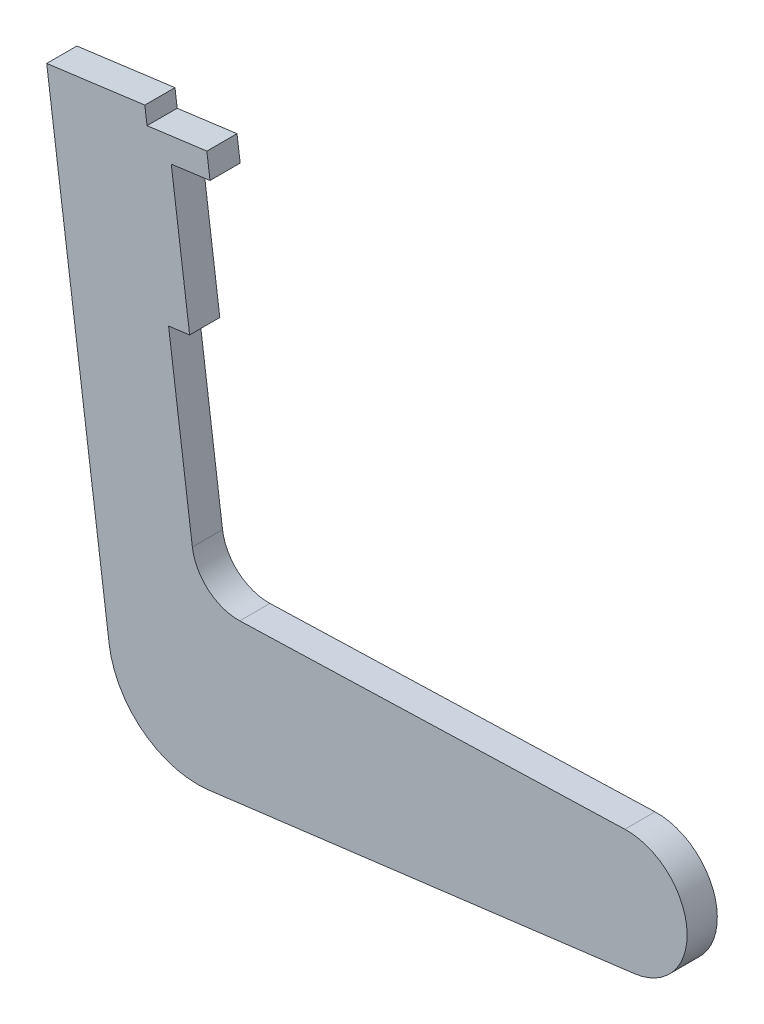
ISO-10303-21;
HEADER;
FILE_DESCRIPTION(('STEP AP214'),'2;1');
FILE_NAME('part.step','',(''),(''),'','','');
FILE_SCHEMA(('AUTOMOTIVE_DESIGN { 1 0 10303 214 1 1 1 1 }'));
ENDSEC;
DATA;
#1=APPLICATION_CONTEXT('core data for automotive mechanical design processes');
#2=APPLICATION_PROTOCOL_DEFINITION('international standard','automotive_design',2000,#1);
#3=PRODUCT_CONTEXT('',#1,'mechanical');
#4=PRODUCT('Part','Part','',(#3));
#5=PRODUCT_RELATED_PRODUCT_CATEGORY('part','',(#4));
#6=PRODUCT_DEFINITION_FORMATION('','',#4);
#7=PRODUCT_DEFINITION_CONTEXT('part definition',#1,'design');
#8=PRODUCT_DEFINITION('design','',#6,#7);
#9=PRODUCT_DEFINITION_SHAPE('','',#8);
#10=(LENGTH_UNIT() NAMED_UNIT(*) SI_UNIT(.MILLI.,.METRE.));
#11=(NAMED_UNIT(*) PLANE_ANGLE_UNIT() SI_UNIT($,.RADIAN.));
#12=(NAMED_UNIT(*) SI_UNIT($,.STERADIAN.) SOLID_ANGLE_UNIT());
#13=UNCERTAINTY_MEASURE_WITH_UNIT(LENGTH_MEASURE(1.E-05),#10,'distance_accuracy_value','');
#14=(GEOMETRIC_REPRESENTATION_CONTEXT(3) GLOBAL_UNCERTAINTY_ASSIGNED_CONTEXT((#13)) GLOBAL_UNIT_ASSIGNED_CONTEXT((#10,
#11,#12)) REPRESENTATION_CONTEXT('',''));
#15=CARTESIAN_POINT('',(0.,0.,0.));
#16=DIRECTION('',(0.,0.,1.));
#17=DIRECTION('',(1.,0.,0.));
#18=AXIS2_PLACEMENT_3D('',#15,#16,#17);
#19=CARTESIAN_POINT('',(-15.3046229831809,46.224450582964,1.5875));
#20=DIRECTION('',(0.991340847616858,0.131313837223228,0.));
#21=DIRECTION('',(-0.131313837223228,0.991340847616858,0.));
#22=AXIS2_PLACEMENT_3D('',#19,#20,#21);
#23=PLANE('',#22);
#24=DIRECTION('',(0.131313837223228,-0.991340847616858,0.));
#25=VECTOR('',#24,1.);
#26=CARTESIAN_POINT('',(-15.3046229831809,46.224450582964,-1.5875));
#27=LINE('',#26,#25);
#28=CARTESIAN_POINT('',(-15.3046229831809,46.224450582964,-1.5875));
#29=VERTEX_POINT('',#28);
#30=CARTESIAN_POINT('',(-8.733941196205,-3.38026275008833,-1.5875));
#31=VERTEX_POINT('',#30);
#32=EDGE_CURVE('E176',#29,#31,#27,.T.);
#33=ORIENTED_EDGE('',*,*,#32,.T.);
#34=DIRECTION('',(0.,0.,-1.));
#35=VECTOR('',#34,1.);
#36=CARTESIAN_POINT('',(-8.733941196205,-3.38026275008833,1.5875));
#37=LINE('',#36,#35);
#38=CARTESIAN_POINT('',(-8.733941196205,-3.38026275008833,1.5875));
#39=VERTEX_POINT('',#38);
#40=EDGE_CURVE('E11',#39,#31,#37,.T.);
#41=ORIENTED_EDGE('',*,*,#40,.F.);
#42=DIRECTION('',(0.131313837223228,-0.991340847616858,0.));
#43=VECTOR('',#42,1.);
#44=CARTESIAN_POINT('',(-15.3046229831809,46.224450582964,1.5875));
#45=LINE('',#44,#43);
#46=CARTESIAN_POINT('',(-15.3046229831809,46.224450582964,1.5875));
#47=VERTEX_POINT('',#46);
#48=EDGE_CURVE('E216',#47,#39,#45,.T.);
#49=ORIENTED_EDGE('',*,*,#48,.F.);
#50=DIRECTION('',(0.,0.,-1.));
#51=VECTOR('',#50,1.);
#52=CARTESIAN_POINT('',(-15.3046229831809,46.224450582964,1.5875));
#53=LINE('',#52,#51);
#54=EDGE_CURVE('E172',#47,#29,#53,.T.);
#55=ORIENTED_EDGE('',*,*,#54,.T.);
#56=EDGE_LOOP('',(#33,#41,#49,#55));
#57=FACE_BOUND('',#56,.T.);
#58=ADVANCED_FACE('F39',(#57),#23,.F.);
#59=CARTESIAN_POINT('',(0.582841403566507,-2.14615394009461,1.5875));
#60=DIRECTION('',(0.,0.,-1.));
#61=DIRECTION('',(-1.,0.,0.));
#62=AXIS2_PLACEMENT_3D('',#59,#60,#61);
#63=CYLINDRICAL_SURFACE('',#62,9.39816272291075);
#64=CARTESIAN_POINT('',(0.582841403566507,-2.14615394009461,-1.5875));
#65=DIRECTION('',(0.,0.,1.));
#66=DIRECTION('',(1.,0.,0.));
#67=AXIS2_PLACEMENT_3D('',#64,#65,#66);
#68=CIRCLE('',#67,9.39816272291075);
#69=CARTESIAN_POINT('',(1.7621034277809,-11.4700374466897,-1.5875));
#70=VERTEX_POINT('',#69);
#71=EDGE_CURVE('E180',#31,#70,#68,.T.);
#72=ORIENTED_EDGE('',*,*,#71,.T.);
#73=DIRECTION('',(0.,0.,-1.));
#74=VECTOR('',#73,1.);
#75=CARTESIAN_POINT('',(1.7621034277809,-11.4700374466897,1.5875));
#76=LINE('',#75,#74);
#77=CARTESIAN_POINT('',(1.7621034277809,-11.4700374466897,1.5875));
#78=VERTEX_POINT('',#77);
#79=EDGE_CURVE('E48',#78,#70,#76,.T.);
#80=ORIENTED_EDGE('',*,*,#79,.F.);
#81=CARTESIAN_POINT('',(0.582841403566507,-2.14615394009461,1.5875));
#82=DIRECTION('',(0.,0.,1.));
#83=DIRECTION('',(1.,0.,0.));
#84=AXIS2_PLACEMENT_3D('',#81,#82,#83);
#85=CIRCLE('',#84,9.39816272291075);
#86=EDGE_CURVE('E117',#39,#78,#85,.T.);
#87=ORIENTED_EDGE('',*,*,#86,.F.);
#88=ORIENTED_EDGE('',*,*,#40,.T.);
#89=EDGE_LOOP('',(#72,#80,#87,#88));
#90=FACE_BOUND('',#89,.T.);
#91=ADVANCED_FACE('F324',(#90),#63,.T.);
#92=CARTESIAN_POINT('',(1.7621034277809,-11.4700374466897,1.5875));
#93=DIRECTION('',(-0.125477932121733,0.992096410915015,0.));
#94=DIRECTION('',(-0.992096410915015,-0.125477932121733,0.));
#95=AXIS2_PLACEMENT_3D('',#92,#93,#94);
#96=PLANE('',#95);
#97=DIRECTION('',(0.992096410915015,0.125477932121733,0.));
#98=VECTOR('',#97,1.);
#99=CARTESIAN_POINT('',(1.7621034277809,-11.4700374466897,-1.5875));
#100=LINE('',#99,#98);
#101=CARTESIAN_POINT('',(46.5301958838679,-5.80787840184098,-1.5875));
#102=VERTEX_POINT('',#101);
#103=EDGE_CURVE('E183',#70,#102,#100,.T.);
#104=ORIENTED_EDGE('',*,*,#103,.T.);
#105=DIRECTION('',(0.,0.,-1.));
#106=VECTOR('',#105,1.);
#107=CARTESIAN_POINT('',(46.5301958838679,-5.80787840184098,1.5875));
#108=LINE('',#107,#106);
#109=CARTESIAN_POINT('',(46.5301958838679,-5.80787840184098,1.5875));
#110=VERTEX_POINT('',#109);
#111=EDGE_CURVE('E251',#110,#102,#108,.T.);
#112=ORIENTED_EDGE('',*,*,#111,.F.);
#113=DIRECTION('',(0.992096410915015,0.125477932121733,0.));
#114=VECTOR('',#113,1.);
#115=CARTESIAN_POINT('',(1.7621034277809,-11.4700374466897,1.5875));
#116=LINE('',#115,#114);
#117=EDGE_CURVE('E261',#78,#110,#116,.T.);
#118=ORIENTED_EDGE('',*,*,#117,.F.);
#119=ORIENTED_EDGE('',*,*,#79,.T.);
#120=EDGE_LOOP('',(#104,#112,#118,#119));
#121=FACE_BOUND('',#120,.T.);
#122=ADVANCED_FACE('F259',(#121),#96,.F.);
#123=CARTESIAN_POINT('',(45.7325212011876,0.498969155999712,1.5875));
#124=DIRECTION('',(0.,0.,-1.));
#125=DIRECTION('',(-1.,0.,0.));
#126=AXIS2_PLACEMENT_3D('',#123,#124,#125);
#127=CYLINDRICAL_SURFACE('',#126,6.35709139601046);
#128=CARTESIAN_POINT('',(45.7325212011876,0.498969155999712,-1.5875));
#129=DIRECTION('',(0.,0.,1.));
#130=DIRECTION('',(1.,0.,0.));
#131=AXIS2_PLACEMENT_3D('',#128,#129,#130);
#132=CIRCLE('',#131,6.35709139601046);
#133=CARTESIAN_POINT('',(45.533364228987,6.85294015984086,-1.5875));
#134=VERTEX_POINT('',#133);
#135=EDGE_CURVE('E186',#102,#134,#132,.T.);
#136=ORIENTED_EDGE('',*,*,#135,.T.);
#137=DIRECTION('',(0.,0.,-1.));
#138=VECTOR('',#137,1.);
#139=CARTESIAN_POINT('',(45.533364228987,6.85294015984086,1.5875));
#140=LINE('',#139,#138);
#141=CARTESIAN_POINT('',(45.533364228987,6.85294015984086,1.5875));
#142=VERTEX_POINT('',#141);
#143=EDGE_CURVE('E247',#142,#134,#140,.T.);
#144=ORIENTED_EDGE('',*,*,#143,.F.);
#145=CARTESIAN_POINT('',(45.7325212011876,0.498969155999712,1.5875));
#146=DIRECTION('',(0.,0.,1.));
#147=DIRECTION('',(1.,0.,0.));
#148=AXIS2_PLACEMENT_3D('',#145,#146,#147);
#149=CIRCLE('',#148,6.35709139601046);
#150=EDGE_CURVE('E280',#110,#142,#149,.T.);
#151=ORIENTED_EDGE('',*,*,#150,.F.);
#152=ORIENTED_EDGE('',*,*,#111,.T.);
#153=EDGE_LOOP('',(#136,#144,#151,#152));
#154=FACE_BOUND('',#153,.T.);
#155=ADVANCED_FACE('F270',(#154),#127,.T.);
#156=CARTESIAN_POINT('',(45.533364228987,6.85294015984086,1.5875));
#157=DIRECTION('',(0.0313283166458152,-0.999509147820139,0.));
#158=DIRECTION('',(0.999509147820139,0.0313283166458152,0.));
#159=AXIS2_PLACEMENT_3D('',#156,#157,#158);
#160=PLANE('',#159);
#161=DIRECTION('',(-0.999509147820139,-0.0313283166458152,0.));
#162=VECTOR('',#161,1.);
#163=CARTESIAN_POINT('',(45.533364228987,6.85294015984086,-1.5875));
#164=LINE('',#163,#162);
#165=CARTESIAN_POINT('',(5.01537701681908,5.58295645233575,-1.5875));
#166=VERTEX_POINT('',#165);
#167=EDGE_CURVE('E189',#134,#166,#164,.T.);
#168=ORIENTED_EDGE('',*,*,#167,.T.);
#169=DIRECTION('',(0.,0.,-1.));
#170=VECTOR('',#169,1.);
#171=CARTESIAN_POINT('',(5.01537701681908,5.58295645233575,1.5875));
#172=LINE('',#171,#170);
#173=CARTESIAN_POINT('',(5.01537701681908,5.58295645233575,1.5875));
#174=VERTEX_POINT('',#173);
#175=EDGE_CURVE('E243',#174,#166,#172,.T.);
#176=ORIENTED_EDGE('',*,*,#175,.F.);
#177=DIRECTION('',(-0.999509147820139,-0.0313283166458152,0.));
#178=VECTOR('',#177,1.);
#179=CARTESIAN_POINT('',(45.533364228987,6.85294015984086,1.5875));
#180=LINE('',#179,#178);
#181=EDGE_CURVE('E276',#142,#174,#180,.T.);
#182=ORIENTED_EDGE('',*,*,#181,.F.);
#183=ORIENTED_EDGE('',*,*,#143,.T.);
#184=EDGE_LOOP('',(#168,#176,#182,#183));
#185=FACE_BOUND('',#184,.T.);
#186=ADVANCED_FACE('F274',(#185),#160,.F.);
#187=CARTESIAN_POINT('',(4.86241844011099,10.4629983130487,1.5875));
#188=DIRECTION('',(0.,0.,-1.));
#189=DIRECTION('',(-1.,0.,0.));
#190=AXIS2_PLACEMENT_3D('',#187,#188,#189);
#191=CYLINDRICAL_SURFACE('',#190,4.88243841625256);
#192=CARTESIAN_POINT('',(4.86241844011099,10.4629983130487,-1.5875));
#193=DIRECTION('',(0.,0.,-1.));
#194=DIRECTION('',(1.,0.,0.));
#195=AXIS2_PLACEMENT_3D('',#192,#193,#194);
#196=CIRCLE('',#195,4.88243841625256);
#197=CARTESIAN_POINT('',(0.0222578021060642,9.82186658960443,-1.5875));
#198=VERTEX_POINT('',#197);
#199=EDGE_CURVE('E192',#166,#198,#196,.T.);
#200=ORIENTED_EDGE('',*,*,#199,.T.);
#201=DIRECTION('',(0.,0.,-1.));
#202=VECTOR('',#201,1.);
#203=CARTESIAN_POINT('',(0.0222578021060642,9.82186658960443,1.5875));
#204=LINE('',#203,#202);
#205=CARTESIAN_POINT('',(0.0222578021060642,9.82186658960443,1.5875));
#206=VERTEX_POINT('',#205);
#207=EDGE_CURVE('E239',#206,#198,#204,.T.);
#208=ORIENTED_EDGE('',*,*,#207,.F.);
#209=CARTESIAN_POINT('',(4.86241844011099,10.4629983130487,1.5875));
#210=DIRECTION('',(0.,0.,-1.));
#211=DIRECTION('',(1.,0.,0.));
#212=AXIS2_PLACEMENT_3D('',#209,#210,#211);
#213=CIRCLE('',#212,4.88243841625256);
#214=EDGE_CURVE('E279',#174,#206,#213,.T.);
#215=ORIENTED_EDGE('',*,*,#214,.F.);
#216=ORIENTED_EDGE('',*,*,#175,.T.);
#217=EDGE_LOOP('',(#200,#208,#215,#216));
#218=FACE_BOUND('',#217,.T.);
#219=ADVANCED_FACE('F337',(#218),#191,.F.);
#220=CARTESIAN_POINT('',(0.0222578021060642,9.82186658960443,1.5875));
#221=DIRECTION('',(-0.991340847616858,-0.131313837223228,0.));
#222=DIRECTION('',(0.131313837223228,-0.991340847616859,0.));
#223=AXIS2_PLACEMENT_3D('',#220,#221,#222);
#224=PLANE('',#223);
#225=DIRECTION('',(-0.131313837223228,0.991340847616858,0.));
#226=VECTOR('',#225,1.);
#227=CARTESIAN_POINT('',(0.0222578021060642,9.82186658960443,-1.5875));
#228=LINE('',#227,#226);
#229=CARTESIAN_POINT('',(-2.47927079699643,28.7069097367056,-1.5875));
#230=VERTEX_POINT('',#229);
#231=EDGE_CURVE('E195',#198,#230,#228,.T.);
#232=ORIENTED_EDGE('',*,*,#231,.T.);
#233=DIRECTION('',(0.,0.,-1.));
#234=VECTOR('',#233,1.);
#235=CARTESIAN_POINT('',(-2.47927079699643,28.7069097367056,1.5875));
#236=LINE('',#235,#234);
#237=CARTESIAN_POINT('',(-2.47927079699643,28.7069097367056,1.5875));
#238=VERTEX_POINT('',#237);
#239=EDGE_CURVE('E235',#238,#230,#236,.T.);
#240=ORIENTED_EDGE('',*,*,#239,.F.);
#241=DIRECTION('',(-0.131313837223228,0.991340847616858,0.));
#242=VECTOR('',#241,1.);
#243=CARTESIAN_POINT('',(0.0222578021060642,9.82186658960443,1.5875));
#244=LINE('',#243,#242);
#245=EDGE_CURVE('E284',#206,#238,#244,.T.);
#246=ORIENTED_EDGE('',*,*,#245,.F.);
#247=ORIENTED_EDGE('',*,*,#207,.T.);
#248=EDGE_LOOP('',(#232,#240,#246,#247));
#249=FACE_BOUND('',#248,.T.);
#250=ADVANCED_FACE('F340',(#249),#224,.F.);
#251=CARTESIAN_POINT('',(-2.47927079699643,28.7069097367056,1.5875));
#252=DIRECTION('',(-0.131313837223227,0.991340847616859,0.));
#253=DIRECTION('',(-0.991340847616859,-0.131313837223227,0.));
#254=AXIS2_PLACEMENT_3D('',#251,#252,#253);
#255=PLANE('',#254);
#256=DIRECTION('',(0.991340847616859,0.131313837223227,0.));
#257=VECTOR('',#256,1.);
#258=CARTESIAN_POINT('',(-2.47927079699643,28.7069097367056,-1.5875));
#259=LINE('',#258,#257);
#260=CARTESIAN_POINT('',(-0.26342573440323,29.0004224256669,-1.5875));
#261=VERTEX_POINT('',#260);
#262=EDGE_CURVE('E198',#230,#261,#259,.T.);
#263=ORIENTED_EDGE('',*,*,#262,.T.);
#264=DIRECTION('',(0.,0.,-1.));
#265=VECTOR('',#264,1.);
#266=CARTESIAN_POINT('',(-0.26342573440323,29.0004224256669,1.5875));
#267=LINE('',#266,#265);
#268=CARTESIAN_POINT('',(-0.26342573440323,29.0004224256669,1.5875));
#269=VERTEX_POINT('',#268);
#270=EDGE_CURVE('E231',#269,#261,#267,.T.);
#271=ORIENTED_EDGE('',*,*,#270,.F.);
#272=DIRECTION('',(0.991340847616859,0.131313837223227,0.));
#273=VECTOR('',#272,1.);
#274=CARTESIAN_POINT('',(-2.47927079699643,28.7069097367056,1.5875));
#275=LINE('',#274,#273);
#276=EDGE_CURVE('E291',#238,#269,#275,.T.);
#277=ORIENTED_EDGE('',*,*,#276,.F.);
#278=ORIENTED_EDGE('',*,*,#239,.T.);
#279=EDGE_LOOP('',(#263,#271,#277,#278));
#280=FACE_BOUND('',#279,.T.);
#281=ADVANCED_FACE('F344',(#280),#255,.F.);
#282=CARTESIAN_POINT('',(-0.26342573440323,29.0004224256669,1.5875));
#283=DIRECTION('',(-0.991340847616858,-0.131313837223229,0.));
#284=DIRECTION('',(0.131313837223229,-0.991340847616858,0.));
#285=AXIS2_PLACEMENT_3D('',#282,#283,#284);
#286=PLANE('',#285);
#287=DIRECTION('',(-0.131313837223229,0.991340847616858,0.));
#288=VECTOR('',#287,1.);
#289=CARTESIAN_POINT('',(-0.26342573440323,29.0004224256669,-1.5875));
#290=LINE('',#289,#288);
#291=CARTESIAN_POINT('',(-2.19794118437583,43.6048557927585,-1.5875));
#292=VERTEX_POINT('',#291);
#293=EDGE_CURVE('E201',#261,#292,#290,.T.);
#294=ORIENTED_EDGE('',*,*,#293,.T.);
#295=DIRECTION('',(0.,0.,-1.));
#296=VECTOR('',#295,1.);
#297=CARTESIAN_POINT('',(-2.19794118437583,43.6048557927585,1.5875));
#298=LINE('',#297,#296);
#299=CARTESIAN_POINT('',(-2.19794118437583,43.6048557927585,1.5875));
#300=VERTEX_POINT('',#299);
#301=EDGE_CURVE('E227',#300,#292,#298,.T.);
#302=ORIENTED_EDGE('',*,*,#301,.F.);
#303=DIRECTION('',(-0.131313837223229,0.991340847616858,0.));
#304=VECTOR('',#303,1.);
#305=CARTESIAN_POINT('',(-0.26342573440323,29.0004224256669,1.5875));
#306=LINE('',#305,#304);
#307=EDGE_CURVE('E294',#269,#300,#306,.T.);
#308=ORIENTED_EDGE('',*,*,#307,.F.);
#309=ORIENTED_EDGE('',*,*,#270,.T.);
#310=EDGE_LOOP('',(#294,#302,#308,#309));
#311=FACE_BOUND('',#310,.T.);
#312=ADVANCED_FACE('F348',(#311),#286,.F.);
#313=CARTESIAN_POINT('',(-2.19794118437583,43.6048557927585,1.5875));
#314=DIRECTION('',(-0.131313837223231,0.991340847616858,0.));
#315=DIRECTION('',(-0.991340847616858,-0.131313837223231,0.));
#316=AXIS2_PLACEMENT_3D('',#313,#314,#315);
#317=PLANE('',#316);
#318=DIRECTION('',(0.991340847616858,0.131313837223231,0.));
#319=VECTOR('',#318,1.);
#320=CARTESIAN_POINT('',(-2.19794118437583,43.6048557927585,-1.5875));
#321=LINE('',#320,#319);
#322=CARTESIAN_POINT('',(1.88122813539802,44.1451859701646,-1.5875));
#323=VERTEX_POINT('',#322);
#324=EDGE_CURVE('E204',#292,#323,#321,.T.);
#325=ORIENTED_EDGE('',*,*,#324,.T.);
#326=DIRECTION('',(0.,0.,-1.));
#327=VECTOR('',#326,1.);
#328=CARTESIAN_POINT('',(1.88122813539802,44.1451859701646,1.5875));
#329=LINE('',#328,#327);
#330=CARTESIAN_POINT('',(1.88122813539802,44.1451859701646,1.5875));
#331=VERTEX_POINT('',#330);
#332=EDGE_CURVE('E223',#331,#323,#329,.T.);
#333=ORIENTED_EDGE('',*,*,#332,.F.);
#334=DIRECTION('',(0.991340847616858,0.131313837223231,0.));
#335=VECTOR('',#334,1.);
#336=CARTESIAN_POINT('',(-2.19794118437583,43.6048557927585,1.5875));
#337=LINE('',#336,#335);
#338=EDGE_CURVE('E297',#300,#331,#337,.T.);
#339=ORIENTED_EDGE('',*,*,#338,.F.);
#340=ORIENTED_EDGE('',*,*,#301,.T.);
#341=EDGE_LOOP('',(#325,#333,#339,#340));
#342=FACE_BOUND('',#341,.T.);
#343=ADVANCED_FACE('F305',(#342),#317,.F.);
#344=CARTESIAN_POINT('',(1.88122813539802,44.1451859701646,1.5875));
#345=DIRECTION('',(-0.991340847616859,-0.131313837223228,0.));
#346=DIRECTION('',(0.131313837223228,-0.991340847616859,0.));
#347=AXIS2_PLACEMENT_3D('',#344,#345,#346);
#348=PLANE('',#347);
#349=DIRECTION('',(-0.131313837223228,0.991340847616859,0.));
#350=VECTOR('',#349,1.);
#351=CARTESIAN_POINT('',(1.88122813539802,44.1451859701646,-1.5875));
#352=LINE('',#351,#350);
#353=CARTESIAN_POINT('',(1.54769098885102,46.6631917231115,-1.5875));
#354=VERTEX_POINT('',#353);
#355=EDGE_CURVE('E207',#323,#354,#352,.T.);
#356=ORIENTED_EDGE('',*,*,#355,.T.);
#357=DIRECTION('',(0.,0.,-1.));
#358=VECTOR('',#357,1.);
#359=CARTESIAN_POINT('',(1.54769098885102,46.6631917231115,1.5875));
#360=LINE('',#359,#358);
#361=CARTESIAN_POINT('',(1.54769098885102,46.6631917231115,1.5875));
#362=VERTEX_POINT('',#361);
#363=EDGE_CURVE('E165',#362,#354,#360,.T.);
#364=ORIENTED_EDGE('',*,*,#363,.F.);
#365=DIRECTION('',(-0.131313837223228,0.991340847616859,0.));
#366=VECTOR('',#365,1.);
#367=CARTESIAN_POINT('',(1.88122813539802,44.1451859701646,1.5875));
#368=LINE('',#367,#366);
#369=EDGE_CURVE('E154',#331,#362,#368,.T.);
#370=ORIENTED_EDGE('',*,*,#369,.F.);
#371=ORIENTED_EDGE('',*,*,#332,.T.);
#372=EDGE_LOOP('',(#356,#364,#370,#371));
#373=FACE_BOUND('',#372,.T.);
#374=ADVANCED_FACE('F309',(#373),#348,.F.);
#375=CARTESIAN_POINT('',(1.54769098885102,46.6631917231115,1.5875));
#376=DIRECTION('',(0.131313837223231,-0.991340847616858,0.));
#377=DIRECTION('',(0.991340847616858,0.131313837223231,0.));
#378=AXIS2_PLACEMENT_3D('',#375,#376,#377);
#379=PLANE('',#378);
#380=DIRECTION('',(-0.991340847616858,-0.131313837223231,0.));
#381=VECTOR('',#380,1.);
#382=CARTESIAN_POINT('',(1.54769098885102,46.6631917231115,-1.5875));
#383=LINE('',#382,#381);
#384=CARTESIAN_POINT('',(-4.74732339351603,45.829348856744,-1.5875));
#385=VERTEX_POINT('',#384);
#386=EDGE_CURVE('E163',#354,#385,#383,.T.);
#387=ORIENTED_EDGE('',*,*,#386,.T.);
#388=DIRECTION('',(0.,0.,-1.));
#389=VECTOR('',#388,1.);
#390=CARTESIAN_POINT('',(-4.74732339351603,45.829348856744,1.5875));
#391=LINE('',#390,#389);
#392=CARTESIAN_POINT('',(-4.74732339351603,45.829348856744,1.5875));
#393=VERTEX_POINT('',#392);
#394=EDGE_CURVE('E160',#393,#385,#391,.T.);
#395=ORIENTED_EDGE('',*,*,#394,.F.);
#396=DIRECTION('',(-0.991340847616858,-0.131313837223231,0.));
#397=VECTOR('',#396,1.);
#398=CARTESIAN_POINT('',(1.54769098885102,46.6631917231115,1.5875));
#399=LINE('',#398,#397);
#400=EDGE_CURVE('E148',#362,#393,#399,.T.);
#401=ORIENTED_EDGE('',*,*,#400,.F.);
#402=ORIENTED_EDGE('',*,*,#363,.T.);
#403=EDGE_LOOP('',(#387,#395,#401,#402));
#404=FACE_BOUND('',#403,.T.);
#405=ADVANCED_FACE('F161',(#404),#379,.F.);
#406=CARTESIAN_POINT('',(-4.74732339351603,45.829348856744,1.5875));
#407=DIRECTION('',(-0.991340847616859,-0.131313837223226,0.));
#408=DIRECTION('',(0.131313837223226,-0.991340847616859,0.));
#409=AXIS2_PLACEMENT_3D('',#406,#407,#408);
#410=PLANE('',#409);
#411=DIRECTION('',(-0.131313837223226,0.991340847616859,0.));
#412=VECTOR('',#411,1.);
#413=CARTESIAN_POINT('',(-4.74732339351603,45.829348856744,-1.5875));
#414=LINE('',#413,#412);
#415=CARTESIAN_POINT('',(-4.98079939609893,47.5919528838067,-1.5875));
#416=VERTEX_POINT('',#415);
#417=EDGE_CURVE('E103',#385,#416,#414,.T.);
#418=ORIENTED_EDGE('',*,*,#417,.T.);
#419=DIRECTION('',(0.,0.,-1.));
#420=VECTOR('',#419,1.);
#421=CARTESIAN_POINT('',(-4.98079939609893,47.5919528838067,1.5875));
#422=LINE('',#421,#420);
#423=CARTESIAN_POINT('',(-4.98079939609893,47.5919528838067,1.5875));
#424=VERTEX_POINT('',#423);
#425=EDGE_CURVE('E166',#424,#416,#422,.T.);
#426=ORIENTED_EDGE('',*,*,#425,.F.);
#427=DIRECTION('',(-0.131313837223226,0.991340847616859,0.));
#428=VECTOR('',#427,1.);
#429=CARTESIAN_POINT('',(-4.74732339351603,45.829348856744,1.5875));
#430=LINE('',#429,#428);
#431=EDGE_CURVE('E152',#393,#424,#430,.T.);
#432=ORIENTED_EDGE('',*,*,#431,.F.);
#433=ORIENTED_EDGE('',*,*,#394,.T.);
#434=EDGE_LOOP('',(#418,#426,#432,#433));
#435=FACE_BOUND('',#434,.T.);
#436=ADVANCED_FACE('F168',(#435),#410,.F.);
#437=CARTESIAN_POINT('',(-4.98079939609893,47.5919528838067,1.5875));
#438=DIRECTION('',(0.131313837223229,-0.991340847616858,0.));
#439=DIRECTION('',(0.991340847616858,0.131313837223229,0.));
#440=AXIS2_PLACEMENT_3D('',#437,#438,#439);
#441=PLANE('',#440);
#442=DIRECTION('',(-0.991340847616858,-0.131313837223229,0.));
#443=VECTOR('',#442,1.);
#444=CARTESIAN_POINT('',(-4.98079939609893,47.5919528838067,-1.5875));
#445=LINE('',#444,#443);
#446=EDGE_CURVE('E109',#416,#29,#445,.T.);
#447=ORIENTED_EDGE('',*,*,#446,.T.);
#448=ORIENTED_EDGE('',*,*,#54,.F.);
#449=DIRECTION('',(-0.991340847616858,-0.131313837223229,0.));
#450=VECTOR('',#449,1.);
#451=CARTESIAN_POINT('',(-4.98079939609893,47.5919528838067,1.5875));
#452=LINE('',#451,#450);
#453=EDGE_CURVE('E56',#424,#47,#452,.T.);
#454=ORIENTED_EDGE('',*,*,#453,.F.);
#455=ORIENTED_EDGE('',*,*,#425,.T.);
#456=EDGE_LOOP('',(#447,#448,#454,#455));
#457=FACE_BOUND('',#456,.T.);
#458=ADVANCED_FACE('F313',(#457),#441,.F.);
#459=CARTESIAN_POINT('',(0.582841403566507,-2.14615394009461,1.5875));
#460=DIRECTION('',(0.,0.,1.));
#461=DIRECTION('',(1.,0.,0.));
#462=AXIS2_PLACEMENT_3D('',#459,#460,#461);
#463=PLANE('',#462);
#464=ORIENTED_EDGE('',*,*,#48,.T.);
#465=ORIENTED_EDGE('',*,*,#86,.T.);
#466=ORIENTED_EDGE('',*,*,#117,.T.);
#467=ORIENTED_EDGE('',*,*,#150,.T.);
#468=ORIENTED_EDGE('',*,*,#181,.T.);
#469=ORIENTED_EDGE('',*,*,#214,.T.);
#470=ORIENTED_EDGE('',*,*,#245,.T.);
#471=ORIENTED_EDGE('',*,*,#276,.T.);
#472=ORIENTED_EDGE('',*,*,#307,.T.);
#473=ORIENTED_EDGE('',*,*,#338,.T.);
#474=ORIENTED_EDGE('',*,*,#369,.T.);
#475=ORIENTED_EDGE('',*,*,#400,.T.);
#476=ORIENTED_EDGE('',*,*,#431,.T.);
#477=ORIENTED_EDGE('',*,*,#453,.T.);
#478=EDGE_LOOP('',(#464,#465,#466,#467,#468,#469,#470,#471,#472,#473,#474,#475,#476,#477));
#479=FACE_BOUND('',#478,.T.);
#480=ADVANCED_FACE('F150',(#479),#463,.T.);
#481=CARTESIAN_POINT('',(0.582841403566507,-2.14615394009461,-1.5875));
#482=DIRECTION('',(0.,0.,1.));
#483=DIRECTION('',(1.,0.,0.));
#484=AXIS2_PLACEMENT_3D('',#481,#482,#483);
#485=PLANE('',#484);
#486=ORIENTED_EDGE('',*,*,#32,.F.);
#487=ORIENTED_EDGE('',*,*,#446,.F.);
#488=ORIENTED_EDGE('',*,*,#417,.F.);
#489=ORIENTED_EDGE('',*,*,#386,.F.);
#490=ORIENTED_EDGE('',*,*,#355,.F.);
#491=ORIENTED_EDGE('',*,*,#324,.F.);
#492=ORIENTED_EDGE('',*,*,#293,.F.);
#493=ORIENTED_EDGE('',*,*,#262,.F.);
#494=ORIENTED_EDGE('',*,*,#231,.F.);
#495=ORIENTED_EDGE('',*,*,#199,.F.);
#496=ORIENTED_EDGE('',*,*,#167,.F.);
#497=ORIENTED_EDGE('',*,*,#135,.F.);
#498=ORIENTED_EDGE('',*,*,#103,.F.);
#499=ORIENTED_EDGE('',*,*,#71,.F.);
#500=EDGE_LOOP('',(#486,#487,#488,#489,#490,#491,#492,#493,#494,#495,#496,#497,#498,#499));
#501=FACE_BOUND('',#500,.T.);
#502=ADVANCED_FACE('F265',(#501),#485,.F.);
#503=CLOSED_SHELL('',(#58,#91,#122,#155,#186,#219,#250,#281,#312,#343,#374,#405,#436,#458,#480,#502));
#504=MANIFOLD_SOLID_BREP('B2',#503);
#505=ADVANCED_BREP_SHAPE_REPRESENTATION('',(#18,#504),#14);
#506=SHAPE_DEFINITION_REPRESENTATION(#9,#505);
ENDSEC;
END-ISO-10303-21;
